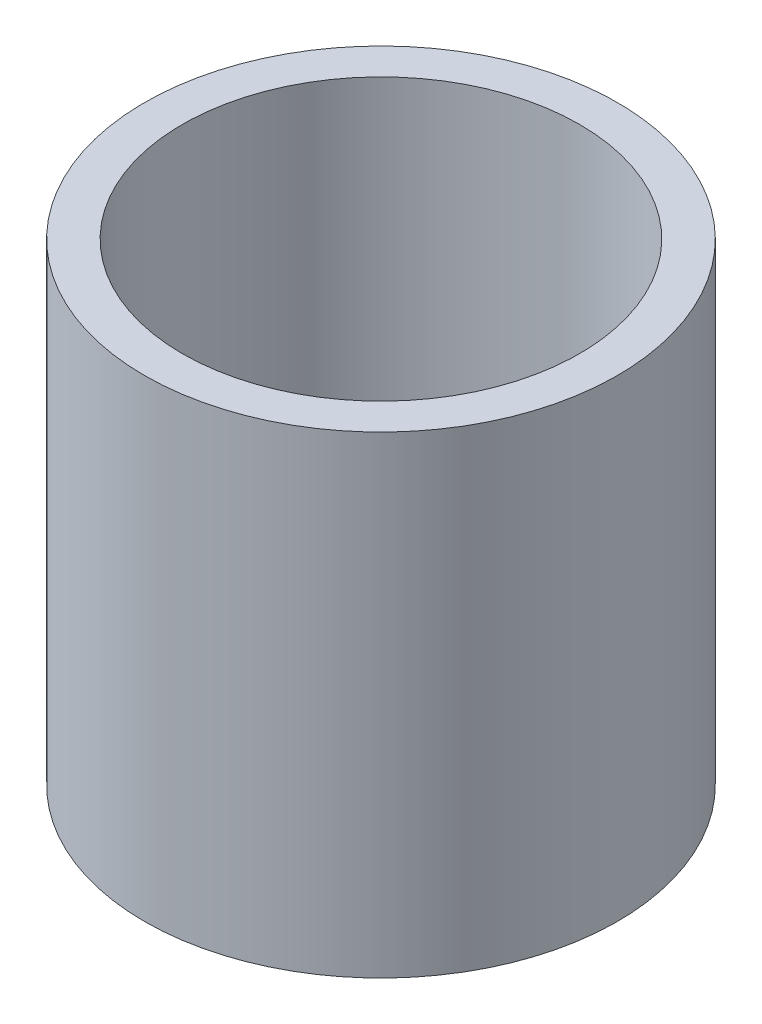
ISO-10303-21;
HEADER;
FILE_DESCRIPTION(('STEP AP214'),'2;1');
FILE_NAME('part.step','',(''),(''),'','','');
FILE_SCHEMA(('AUTOMOTIVE_DESIGN { 1 0 10303 214 1 1 1 1 }'));
ENDSEC;
DATA;
#1=APPLICATION_CONTEXT('core data for automotive mechanical design processes');
#2=APPLICATION_PROTOCOL_DEFINITION('international standard','automotive_design',2000,#1);
#3=PRODUCT_CONTEXT('',#1,'mechanical');
#4=PRODUCT('Part','Part','',(#3));
#5=PRODUCT_RELATED_PRODUCT_CATEGORY('part','',(#4));
#6=PRODUCT_DEFINITION_FORMATION('','',#4);
#7=PRODUCT_DEFINITION_CONTEXT('part definition',#1,'design');
#8=PRODUCT_DEFINITION('design','',#6,#7);
#9=PRODUCT_DEFINITION_SHAPE('','',#8);
#10=(LENGTH_UNIT() NAMED_UNIT(*) SI_UNIT(.MILLI.,.METRE.));
#11=(NAMED_UNIT(*) PLANE_ANGLE_UNIT() SI_UNIT($,.RADIAN.));
#12=(NAMED_UNIT(*) SI_UNIT($,.STERADIAN.) SOLID_ANGLE_UNIT());
#13=UNCERTAINTY_MEASURE_WITH_UNIT(LENGTH_MEASURE(1.E-05),#10,'distance_accuracy_value','');
#14=(GEOMETRIC_REPRESENTATION_CONTEXT(3) GLOBAL_UNCERTAINTY_ASSIGNED_CONTEXT((#13)) GLOBAL_UNIT_ASSIGNED_CONTEXT((#10,
#11,#12)) REPRESENTATION_CONTEXT('',''));
#15=CARTESIAN_POINT('',(0.,0.,0.));
#16=DIRECTION('',(0.,0.,1.));
#17=DIRECTION('',(1.,0.,0.));
#18=AXIS2_PLACEMENT_3D('',#15,#16,#17);
#19=CARTESIAN_POINT('',(0.866701165106361,25.,1.19171410202129));
#20=DIRECTION('',(0.,-1.,0.));
#21=DIRECTION('',(0.,0.,-1.));
#22=AXIS2_PLACEMENT_3D('',#19,#20,#21);
#23=CYLINDRICAL_SURFACE('',#22,12.5);
#24=CARTESIAN_POINT('',(0.866701165106361,25.,1.19171410202129));
#25=DIRECTION('',(0.,1.,0.));
#26=DIRECTION('',(0.,0.,1.));
#27=AXIS2_PLACEMENT_3D('',#24,#25,#26);
#28=CIRCLE('',#27,12.5);
#29=CARTESIAN_POINT('',(0.866701165106361,25.,13.6917141020213));
#30=VERTEX_POINT('',#29);
#31=EDGE_CURVE('E10',#30,#30,#28,.T.);
#32=ORIENTED_EDGE('',*,*,#31,.F.);
#33=EDGE_LOOP('',(#32));
#34=FACE_BOUND('',#33,.T.);
#35=CARTESIAN_POINT('',(0.866701165106361,0.,1.19171410202129));
#36=DIRECTION('',(0.,1.,0.));
#37=DIRECTION('',(0.,0.,1.));
#38=AXIS2_PLACEMENT_3D('',#35,#36,#37);
#39=CIRCLE('',#38,12.5);
#40=CARTESIAN_POINT('',(0.866701165106361,0.,13.6917141020213));
#41=VERTEX_POINT('',#40);
#42=EDGE_CURVE('E45',#41,#41,#39,.T.);
#43=ORIENTED_EDGE('',*,*,#42,.T.);
#44=EDGE_LOOP('',(#43));
#45=FACE_BOUND('',#44,.T.);
#46=ADVANCED_FACE('F37',(#34,#45),#23,.T.);
#47=CARTESIAN_POINT('',(0.866701165106361,25.,1.19171410202129));
#48=DIRECTION('',(0.,1.,0.));
#49=DIRECTION('',(0.,0.,1.));
#50=AXIS2_PLACEMENT_3D('',#47,#48,#49);
#51=PLANE('',#50);
#52=CARTESIAN_POINT('',(0.866701165106361,25.,1.19171410202129));
#53=DIRECTION('',(0.,1.,0.));
#54=DIRECTION('',(0.,0.,1.));
#55=AXIS2_PLACEMENT_3D('',#52,#53,#54);
#56=CIRCLE('',#55,10.5);
#57=CARTESIAN_POINT('',(0.866701165106361,25.,11.6917141020213));
#58=VERTEX_POINT('',#57);
#59=EDGE_CURVE('E51',#58,#58,#56,.T.);
#60=ORIENTED_EDGE('',*,*,#59,.F.);
#61=EDGE_LOOP('',(#60));
#62=FACE_BOUND('',#61,.T.);
#63=ORIENTED_EDGE('',*,*,#31,.T.);
#64=EDGE_LOOP('',(#63));
#65=FACE_BOUND('',#64,.T.);
#66=ADVANCED_FACE('F84',(#62,#65),#51,.T.);
#67=CARTESIAN_POINT('',(0.866701165106361,0.,1.19171410202129));
#68=DIRECTION('',(0.,1.,0.));
#69=DIRECTION('',(0.,0.,1.));
#70=AXIS2_PLACEMENT_3D('',#67,#68,#69);
#71=PLANE('',#70);
#72=CARTESIAN_POINT('',(0.866701165106361,0.,1.19171410202129));
#73=DIRECTION('',(0.,1.,0.));
#74=DIRECTION('',(0.,0.,1.));
#75=AXIS2_PLACEMENT_3D('',#72,#73,#74);
#76=CIRCLE('',#75,3.);
#77=CARTESIAN_POINT('',(0.866701165106361,0.,4.19171410202129));
#78=VERTEX_POINT('',#77);
#79=EDGE_CURVE('E40',#78,#78,#76,.T.);
#80=ORIENTED_EDGE('',*,*,#79,.T.);
#81=EDGE_LOOP('',(#80));
#82=FACE_BOUND('',#81,.T.);
#83=ORIENTED_EDGE('',*,*,#42,.F.);
#84=EDGE_LOOP('',(#83));
#85=FACE_BOUND('',#84,.T.);
#86=ADVANCED_FACE('F69',(#82,#85),#71,.F.);
#87=CARTESIAN_POINT('',(0.866701165106361,25.,1.19171410202129));
#88=DIRECTION('',(0.,-1.,0.));
#89=DIRECTION('',(0.,0.,-1.));
#90=AXIS2_PLACEMENT_3D('',#87,#88,#89);
#91=CYLINDRICAL_SURFACE('',#90,10.5);
#92=ORIENTED_EDGE('',*,*,#59,.T.);
#93=EDGE_LOOP('',(#92));
#94=FACE_BOUND('',#93,.T.);
#95=CARTESIAN_POINT('',(0.866701165106361,2.,1.19171410202129));
#96=DIRECTION('',(0.,1.,0.));
#97=DIRECTION('',(0.,0.,1.));
#98=AXIS2_PLACEMENT_3D('',#95,#96,#97);
#99=CIRCLE('',#98,10.5);
#100=CARTESIAN_POINT('',(0.866701165106361,2.,11.6917141020213));
#101=VERTEX_POINT('',#100);
#102=EDGE_CURVE('E56',#101,#101,#99,.T.);
#103=ORIENTED_EDGE('',*,*,#102,.F.);
#104=EDGE_LOOP('',(#103));
#105=FACE_BOUND('',#104,.T.);
#106=ADVANCED_FACE('F79',(#94,#105),#91,.F.);
#107=CARTESIAN_POINT('',(0.866701165106361,2.,1.19171410202129));
#108=DIRECTION('',(0.,1.,0.));
#109=DIRECTION('',(0.,0.,1.));
#110=AXIS2_PLACEMENT_3D('',#107,#108,#109);
#111=PLANE('',#110);
#112=CARTESIAN_POINT('',(0.866701165106361,2.,1.19171410202129));
#113=DIRECTION('',(0.,1.,0.));
#114=DIRECTION('',(0.,0.,1.));
#115=AXIS2_PLACEMENT_3D('',#112,#113,#114);
#116=CIRCLE('',#115,3.);
#117=CARTESIAN_POINT('',(0.866701165106361,2.,4.19171410202129));
#118=VERTEX_POINT('',#117);
#119=EDGE_CURVE('E60',#118,#118,#116,.T.);
#120=ORIENTED_EDGE('',*,*,#119,.F.);
#121=EDGE_LOOP('',(#120));
#122=FACE_BOUND('',#121,.T.);
#123=ORIENTED_EDGE('',*,*,#102,.T.);
#124=EDGE_LOOP('',(#123));
#125=FACE_BOUND('',#124,.T.);
#126=ADVANCED_FACE('F74',(#122,#125),#111,.T.);
#127=CARTESIAN_POINT('',(0.866701165106361,-23.,1.19171410202129));
#128=DIRECTION('',(0.,1.,0.));
#129=DIRECTION('',(0.,0.,1.));
#130=AXIS2_PLACEMENT_3D('',#127,#128,#129);
#131=CYLINDRICAL_SURFACE('',#130,3.);
#132=ORIENTED_EDGE('',*,*,#119,.T.);
#133=EDGE_LOOP('',(#132));
#134=FACE_BOUND('',#133,.T.);
#135=ORIENTED_EDGE('',*,*,#79,.F.);
#136=EDGE_LOOP('',(#135));
#137=FACE_BOUND('',#136,.T.);
#138=ADVANCED_FACE('F72',(#134,#137),#131,.F.);
#139=CLOSED_SHELL('',(#46,#66,#86,#106,#126,#138));
#140=MANIFOLD_SOLID_BREP('B2',#139);
#141=ADVANCED_BREP_SHAPE_REPRESENTATION('',(#18,#140),#14);
#142=SHAPE_DEFINITION_REPRESENTATION(#9,#141);
ENDSEC;
END-ISO-10303-21;
